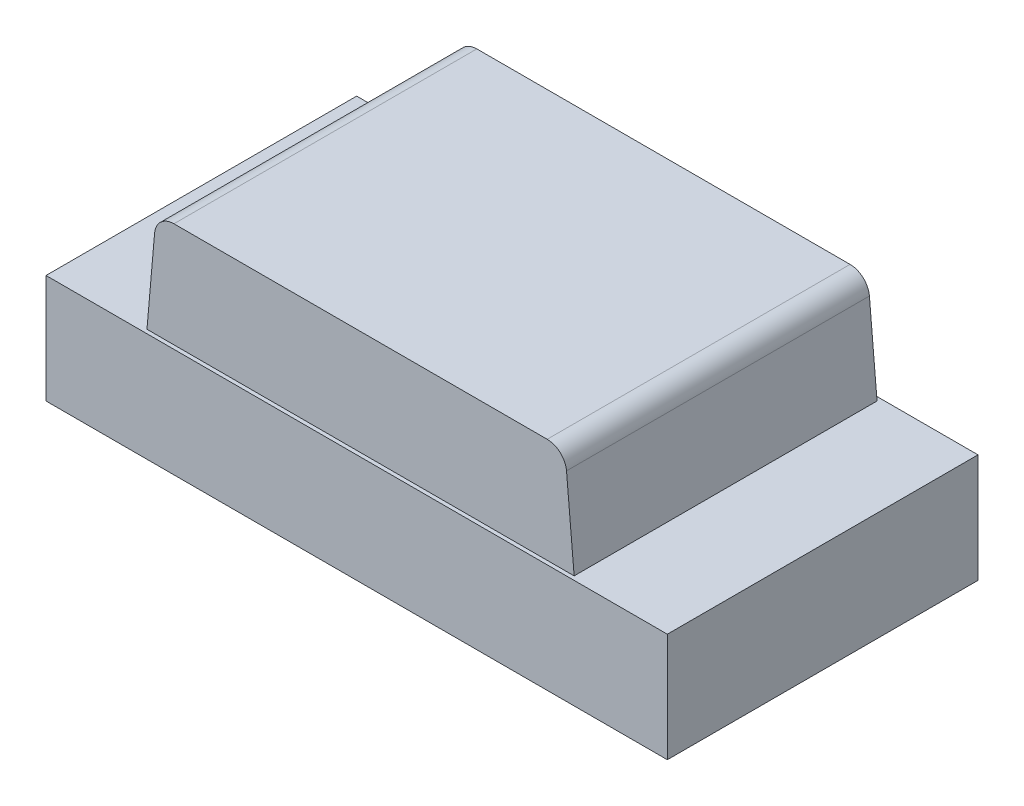
ISO-10303-21;
HEADER;
FILE_DESCRIPTION(('STEP AP214'),'2;1');
FILE_NAME('part.step','',(''),(''),'','','');
FILE_SCHEMA(('AUTOMOTIVE_DESIGN { 1 0 10303 214 1 1 1 1 }'));
ENDSEC;
DATA;
#1=APPLICATION_CONTEXT('core data for automotive mechanical design processes');
#2=APPLICATION_PROTOCOL_DEFINITION('international standard','automotive_design',2000,#1);
#3=PRODUCT_CONTEXT('',#1,'mechanical');
#4=PRODUCT('Part','Part','',(#3));
#5=PRODUCT_RELATED_PRODUCT_CATEGORY('part','',(#4));
#6=PRODUCT_DEFINITION_FORMATION('','',#4);
#7=PRODUCT_DEFINITION_CONTEXT('part definition',#1,'design');
#8=PRODUCT_DEFINITION('design','',#6,#7);
#9=PRODUCT_DEFINITION_SHAPE('','',#8);
#10=(LENGTH_UNIT() NAMED_UNIT(*) SI_UNIT(.MILLI.,.METRE.));
#11=(NAMED_UNIT(*) PLANE_ANGLE_UNIT() SI_UNIT($,.RADIAN.));
#12=(NAMED_UNIT(*) SI_UNIT($,.STERADIAN.) SOLID_ANGLE_UNIT());
#13=UNCERTAINTY_MEASURE_WITH_UNIT(LENGTH_MEASURE(1.E-05),#10,'distance_accuracy_value','');
#14=(GEOMETRIC_REPRESENTATION_CONTEXT(3) GLOBAL_UNCERTAINTY_ASSIGNED_CONTEXT((#13)) GLOBAL_UNIT_ASSIGNED_CONTEXT((#10,
#11,#12)) REPRESENTATION_CONTEXT('',''));
#15=CARTESIAN_POINT('',(0.,0.,0.));
#16=DIRECTION('',(0.,0.,1.));
#17=DIRECTION('',(1.,0.,0.));
#18=AXIS2_PLACEMENT_3D('',#15,#16,#17);
#19=CARTESIAN_POINT('',(0.,0.28,0.));
#20=DIRECTION('',(0.,1.,0.));
#21=DIRECTION('',(0.,0.,1.));
#22=AXIS2_PLACEMENT_3D('',#19,#20,#21);
#23=PLANE('',#22);
#24=DIRECTION('',(0.,0.,1.));
#25=VECTOR('',#24,1.);
#26=CARTESIAN_POINT('',(-0.8,0.28,0.4));
#27=LINE('',#26,#25);
#28=CARTESIAN_POINT('',(-0.8,0.28,-0.4));
#29=VERTEX_POINT('',#28);
#30=CARTESIAN_POINT('',(-0.8,0.28,0.4));
#31=VERTEX_POINT('',#30);
#32=EDGE_CURVE('E146',#29,#31,#27,.T.);
#33=ORIENTED_EDGE('',*,*,#32,.T.);
#34=DIRECTION('',(1.,0.,0.));
#35=VECTOR('',#34,1.);
#36=CARTESIAN_POINT('',(0.8,0.28,0.4));
#37=LINE('',#36,#35);
#38=CARTESIAN_POINT('',(0.8,0.28,0.4));
#39=VERTEX_POINT('',#38);
#40=EDGE_CURVE('E149',#31,#39,#37,.T.);
#41=ORIENTED_EDGE('',*,*,#40,.T.);
#42=DIRECTION('',(0.,0.,-1.));
#43=VECTOR('',#42,1.);
#44=CARTESIAN_POINT('',(0.8,0.28,0.4));
#45=LINE('',#44,#43);
#46=CARTESIAN_POINT('',(0.8,0.28,-0.4));
#47=VERTEX_POINT('',#46);
#48=EDGE_CURVE('E152',#39,#47,#45,.T.);
#49=ORIENTED_EDGE('',*,*,#48,.T.);
#50=DIRECTION('',(-1.,0.,0.));
#51=VECTOR('',#50,1.);
#52=CARTESIAN_POINT('',(0.8,0.28,-0.4));
#53=LINE('',#52,#51);
#54=EDGE_CURVE('E154',#47,#29,#53,.T.);
#55=ORIENTED_EDGE('',*,*,#54,.T.);
#56=EDGE_LOOP('',(#33,#41,#49,#55));
#57=FACE_BOUND('',#56,.T.);
#58=DIRECTION('',(0.,0.,-1.));
#59=VECTOR('',#58,1.);
#60=CARTESIAN_POINT('',(0.55,0.28,1.53265175583672));
#61=LINE('',#60,#59);
#62=CARTESIAN_POINT('',(0.55,0.28,0.39));
#63=VERTEX_POINT('',#62);
#64=CARTESIAN_POINT('',(0.55,0.28,-0.39));
#65=VERTEX_POINT('',#64);
#66=EDGE_CURVE('E136',#63,#65,#61,.T.);
#67=ORIENTED_EDGE('',*,*,#66,.F.);
#68=DIRECTION('',(-1.,0.,0.));
#69=VECTOR('',#68,1.);
#70=CARTESIAN_POINT('',(0.55,0.28,0.39));
#71=LINE('',#70,#69);
#72=CARTESIAN_POINT('',(-0.55,0.28,0.39));
#73=VERTEX_POINT('',#72);
#74=EDGE_CURVE('E135',#63,#73,#71,.T.);
#75=ORIENTED_EDGE('',*,*,#74,.T.);
#76=DIRECTION('',(0.,0.,-1.));
#77=VECTOR('',#76,1.);
#78=CARTESIAN_POINT('',(-0.55,0.28,1.53265175583672));
#79=LINE('',#78,#77);
#80=CARTESIAN_POINT('',(-0.55,0.28,-0.39));
#81=VERTEX_POINT('',#80);
#82=EDGE_CURVE('E129',#73,#81,#79,.T.);
#83=ORIENTED_EDGE('',*,*,#82,.T.);
#84=DIRECTION('',(-1.,0.,0.));
#85=VECTOR('',#84,1.);
#86=CARTESIAN_POINT('',(0.55,0.28,-0.39));
#87=LINE('',#86,#85);
#88=EDGE_CURVE('E115',#65,#81,#87,.T.);
#89=ORIENTED_EDGE('',*,*,#88,.F.);
#90=EDGE_LOOP('',(#67,#75,#83,#89));
#91=FACE_BOUND('',#90,.T.);
#92=ADVANCED_FACE('F36',(#57,#91),#23,.T.);
#93=CARTESIAN_POINT('',(-0.8,0.28,0.4));
#94=DIRECTION('',(1.,0.,0.));
#95=DIRECTION('',(0.,0.,-1.));
#96=AXIS2_PLACEMENT_3D('',#93,#94,#95);
#97=PLANE('',#96);
#98=DIRECTION('',(0.,0.,1.));
#99=VECTOR('',#98,1.);
#100=CARTESIAN_POINT('',(-0.8,0.,0.4));
#101=LINE('',#100,#99);
#102=CARTESIAN_POINT('',(-0.8,0.,-0.4));
#103=VERTEX_POINT('',#102);
#104=CARTESIAN_POINT('',(-0.8,0.,0.4));
#105=VERTEX_POINT('',#104);
#106=EDGE_CURVE('E157',#103,#105,#101,.T.);
#107=ORIENTED_EDGE('',*,*,#106,.T.);
#108=DIRECTION('',(0.,-1.,0.));
#109=VECTOR('',#108,1.);
#110=CARTESIAN_POINT('',(-0.8,0.28,0.4));
#111=LINE('',#110,#109);
#112=EDGE_CURVE('E173',#31,#105,#111,.T.);
#113=ORIENTED_EDGE('',*,*,#112,.F.);
#114=ORIENTED_EDGE('',*,*,#32,.F.);
#115=DIRECTION('',(0.,-1.,0.));
#116=VECTOR('',#115,1.);
#117=CARTESIAN_POINT('',(-0.8,0.28,-0.4));
#118=LINE('',#117,#116);
#119=EDGE_CURVE('E156',#29,#103,#118,.T.);
#120=ORIENTED_EDGE('',*,*,#119,.T.);
#121=EDGE_LOOP('',(#107,#113,#114,#120));
#122=FACE_BOUND('',#121,.T.);
#123=ADVANCED_FACE('F206',(#122),#97,.F.);
#124=CARTESIAN_POINT('',(0.8,0.28,0.4));
#125=DIRECTION('',(0.,0.,-1.));
#126=DIRECTION('',(-1.,0.,0.));
#127=AXIS2_PLACEMENT_3D('',#124,#125,#126);
#128=PLANE('',#127);
#129=DIRECTION('',(1.,0.,0.));
#130=VECTOR('',#129,1.);
#131=CARTESIAN_POINT('',(0.8,0.,0.4));
#132=LINE('',#131,#130);
#133=CARTESIAN_POINT('',(0.8,0.,0.4));
#134=VERTEX_POINT('',#133);
#135=EDGE_CURVE('E160',#105,#134,#132,.T.);
#136=ORIENTED_EDGE('',*,*,#135,.T.);
#137=DIRECTION('',(0.,-1.,0.));
#138=VECTOR('',#137,1.);
#139=CARTESIAN_POINT('',(0.8,0.28,0.4));
#140=LINE('',#139,#138);
#141=EDGE_CURVE('E170',#39,#134,#140,.T.);
#142=ORIENTED_EDGE('',*,*,#141,.F.);
#143=ORIENTED_EDGE('',*,*,#40,.F.);
#144=ORIENTED_EDGE('',*,*,#112,.T.);
#145=EDGE_LOOP('',(#136,#142,#143,#144));
#146=FACE_BOUND('',#145,.T.);
#147=ADVANCED_FACE('F212',(#146),#128,.F.);
#148=CARTESIAN_POINT('',(0.8,0.28,0.4));
#149=DIRECTION('',(-1.,0.,0.));
#150=DIRECTION('',(0.,0.,1.));
#151=AXIS2_PLACEMENT_3D('',#148,#149,#150);
#152=PLANE('',#151);
#153=DIRECTION('',(0.,0.,-1.));
#154=VECTOR('',#153,1.);
#155=CARTESIAN_POINT('',(0.8,0.,0.4));
#156=LINE('',#155,#154);
#157=CARTESIAN_POINT('',(0.8,0.,-0.4));
#158=VERTEX_POINT('',#157);
#159=EDGE_CURVE('E162',#134,#158,#156,.T.);
#160=ORIENTED_EDGE('',*,*,#159,.T.);
#161=DIRECTION('',(0.,-1.,0.));
#162=VECTOR('',#161,1.);
#163=CARTESIAN_POINT('',(0.8,0.28,-0.4));
#164=LINE('',#163,#162);
#165=EDGE_CURVE('E167',#47,#158,#164,.T.);
#166=ORIENTED_EDGE('',*,*,#165,.F.);
#167=ORIENTED_EDGE('',*,*,#48,.F.);
#168=ORIENTED_EDGE('',*,*,#141,.T.);
#169=EDGE_LOOP('',(#160,#166,#167,#168));
#170=FACE_BOUND('',#169,.T.);
#171=ADVANCED_FACE('F225',(#170),#152,.F.);
#172=CARTESIAN_POINT('',(0.8,0.28,-0.4));
#173=DIRECTION('',(0.,0.,1.));
#174=DIRECTION('',(1.,0.,0.));
#175=AXIS2_PLACEMENT_3D('',#172,#173,#174);
#176=PLANE('',#175);
#177=DIRECTION('',(-1.,0.,0.));
#178=VECTOR('',#177,1.);
#179=CARTESIAN_POINT('',(0.8,0.,-0.4));
#180=LINE('',#179,#178);
#181=EDGE_CURVE('E150',#158,#103,#180,.T.);
#182=ORIENTED_EDGE('',*,*,#181,.T.);
#183=ORIENTED_EDGE('',*,*,#119,.F.);
#184=ORIENTED_EDGE('',*,*,#54,.F.);
#185=ORIENTED_EDGE('',*,*,#165,.T.);
#186=EDGE_LOOP('',(#182,#183,#184,#185));
#187=FACE_BOUND('',#186,.T.);
#188=ADVANCED_FACE('F221',(#187),#176,.F.);
#189=CARTESIAN_POINT('',(0.,0.,0.));
#190=DIRECTION('',(0.,1.,0.));
#191=DIRECTION('',(0.,0.,1.));
#192=AXIS2_PLACEMENT_3D('',#189,#190,#191);
#193=PLANE('',#192);
#194=ORIENTED_EDGE('',*,*,#106,.F.);
#195=ORIENTED_EDGE('',*,*,#181,.F.);
#196=ORIENTED_EDGE('',*,*,#159,.F.);
#197=ORIENTED_EDGE('',*,*,#135,.F.);
#198=EDGE_LOOP('',(#194,#195,#196,#197));
#199=FACE_BOUND('',#198,.T.);
#200=ADVANCED_FACE('F218',(#199),#193,.F.);
#201=CARTESIAN_POINT('',(-0.55,0.28,1.53265175583672));
#202=DIRECTION('',(0.996194698091746,-0.0871557427476546,0.));
#203=DIRECTION('',(0.0871557427476546,0.996194698091746,0.));
#204=AXIS2_PLACEMENT_3D('',#201,#202,#203);
#205=PLANE('',#204);
#206=DIRECTION('',(0.0871557427476546,0.996194698091746,0.));
#207=VECTOR('',#206,1.);
#208=CARTESIAN_POINT('',(-0.55,0.28,0.39));
#209=LINE('',#208,#207);
#210=CARTESIAN_POINT('',(-0.530371237051718,0.504357787137383,0.39));
#211=VERTEX_POINT('',#210);
#212=EDGE_CURVE('E138',#73,#211,#209,.T.);
#213=ORIENTED_EDGE('',*,*,#212,.T.);
#214=DIRECTION('',(0.,0.,-1.));
#215=VECTOR('',#214,1.);
#216=CARTESIAN_POINT('',(-0.530371237051718,0.504357787137383,1.53265175583672));
#217=LINE('',#216,#215);
#218=CARTESIAN_POINT('',(-0.530371237051718,0.504357787137383,-0.39));
#219=VERTEX_POINT('',#218);
#220=EDGE_CURVE('E12',#211,#219,#217,.T.);
#221=ORIENTED_EDGE('',*,*,#220,.T.);
#222=DIRECTION('',(0.0871557427476546,0.996194698091746,0.));
#223=VECTOR('',#222,1.);
#224=CARTESIAN_POINT('',(-0.55,0.28,-0.39));
#225=LINE('',#224,#223);
#226=EDGE_CURVE('E119',#81,#219,#225,.T.);
#227=ORIENTED_EDGE('',*,*,#226,.F.);
#228=ORIENTED_EDGE('',*,*,#82,.F.);
#229=EDGE_LOOP('',(#213,#221,#227,#228));
#230=FACE_BOUND('',#229,.T.);
#231=ADVANCED_FACE('F128',(#230),#205,.F.);
#232=CARTESIAN_POINT('',(-0.526378060848002,0.55,1.53265175583672));
#233=DIRECTION('',(0.,-1.,0.));
#234=DIRECTION('',(0.,0.,-1.));
#235=AXIS2_PLACEMENT_3D('',#232,#233,#234);
#236=PLANE('',#235);
#237=DIRECTION('',(1.,0.,0.));
#238=VECTOR('',#237,1.);
#239=CARTESIAN_POINT('',(-0.526378060848002,0.55,0.39));
#240=LINE('',#239,#238);
#241=CARTESIAN_POINT('',(-0.48056150214713,0.55,0.39));
#242=VERTEX_POINT('',#241);
#243=CARTESIAN_POINT('',(0.48056150214713,0.55,0.39));
#244=VERTEX_POINT('',#243);
#245=EDGE_CURVE('E145',#242,#244,#240,.T.);
#246=ORIENTED_EDGE('',*,*,#245,.T.);
#247=DIRECTION('',(0.,0.,-1.));
#248=VECTOR('',#247,1.);
#249=CARTESIAN_POINT('',(0.48056150214713,0.55,1.53265175583672));
#250=LINE('',#249,#248);
#251=CARTESIAN_POINT('',(0.48056150214713,0.55,-0.39));
#252=VERTEX_POINT('',#251);
#253=EDGE_CURVE('E178',#244,#252,#250,.T.);
#254=ORIENTED_EDGE('',*,*,#253,.T.);
#255=DIRECTION('',(1.,0.,0.));
#256=VECTOR('',#255,1.);
#257=CARTESIAN_POINT('',(-0.526378060848001,0.55,-0.39));
#258=LINE('',#257,#256);
#259=CARTESIAN_POINT('',(-0.48056150214713,0.55,-0.39));
#260=VERTEX_POINT('',#259);
#261=EDGE_CURVE('E132',#260,#252,#258,.T.);
#262=ORIENTED_EDGE('',*,*,#261,.F.);
#263=DIRECTION('',(0.,0.,-1.));
#264=VECTOR('',#263,1.);
#265=CARTESIAN_POINT('',(-0.48056150214713,0.55,1.53265175583672));
#266=LINE('',#265,#264);
#267=EDGE_CURVE('E176',#260,#242,#266,.F.);
#268=ORIENTED_EDGE('',*,*,#267,.T.);
#269=EDGE_LOOP('',(#246,#254,#262,#268));
#270=FACE_BOUND('',#269,.T.);
#271=ADVANCED_FACE('F193',(#270),#236,.F.);
#272=CARTESIAN_POINT('',(0.526378060848002,0.55,1.53265175583672));
#273=DIRECTION('',(-0.996194698091746,-0.0871557427476546,0.));
#274=DIRECTION('',(0.0871557427476546,-0.996194698091746,0.));
#275=AXIS2_PLACEMENT_3D('',#272,#273,#274);
#276=PLANE('',#275);
#277=DIRECTION('',(0.0871557427476546,-0.996194698091746,0.));
#278=VECTOR('',#277,1.);
#279=CARTESIAN_POINT('',(0.526378060848002,0.55,-0.39));
#280=LINE('',#279,#278);
#281=CARTESIAN_POINT('',(0.530371237051718,0.504357787137383,-0.39));
#282=VERTEX_POINT('',#281);
#283=EDGE_CURVE('E120',#282,#65,#280,.T.);
#284=ORIENTED_EDGE('',*,*,#283,.F.);
#285=DIRECTION('',(0.,0.,-1.));
#286=VECTOR('',#285,1.);
#287=CARTESIAN_POINT('',(0.530371237051718,0.504357787137383,1.53265175583672));
#288=LINE('',#287,#286);
#289=CARTESIAN_POINT('',(0.530371237051718,0.504357787137383,0.39));
#290=VERTEX_POINT('',#289);
#291=EDGE_CURVE('E59',#282,#290,#288,.F.);
#292=ORIENTED_EDGE('',*,*,#291,.T.);
#293=DIRECTION('',(0.0871557427476546,-0.996194698091746,0.));
#294=VECTOR('',#293,1.);
#295=CARTESIAN_POINT('',(0.526378060848002,0.55,0.39));
#296=LINE('',#295,#294);
#297=EDGE_CURVE('E189',#290,#63,#296,.T.);
#298=ORIENTED_EDGE('',*,*,#297,.T.);
#299=ORIENTED_EDGE('',*,*,#66,.T.);
#300=EDGE_LOOP('',(#284,#292,#298,#299));
#301=FACE_BOUND('',#300,.T.);
#302=ADVANCED_FACE('F198',(#301),#276,.F.);
#303=CARTESIAN_POINT('',(0.8,0.28,0.39));
#304=DIRECTION('',(0.,0.,-1.));
#305=DIRECTION('',(-1.,0.,0.));
#306=AXIS2_PLACEMENT_3D('',#303,#304,#305);
#307=PLANE('',#306);
#308=ORIENTED_EDGE('',*,*,#297,.F.);
#309=CARTESIAN_POINT('',(0.48056150214713,0.5,0.39));
#310=DIRECTION('',(0.,0.,-1.));
#311=DIRECTION('',(-1.,0.,0.));
#312=AXIS2_PLACEMENT_3D('',#309,#310,#311);
#313=CIRCLE('',#312,0.05);
#314=EDGE_CURVE('E44',#290,#244,#313,.F.);
#315=ORIENTED_EDGE('',*,*,#314,.T.);
#316=ORIENTED_EDGE('',*,*,#245,.F.);
#317=CARTESIAN_POINT('',(-0.48056150214713,0.5,0.39));
#318=DIRECTION('',(0.,0.,-1.));
#319=DIRECTION('',(-1.,0.,0.));
#320=AXIS2_PLACEMENT_3D('',#317,#318,#319);
#321=CIRCLE('',#320,0.05);
#322=EDGE_CURVE('E51',#242,#211,#321,.F.);
#323=ORIENTED_EDGE('',*,*,#322,.T.);
#324=ORIENTED_EDGE('',*,*,#212,.F.);
#325=ORIENTED_EDGE('',*,*,#74,.F.);
#326=EDGE_LOOP('',(#308,#315,#316,#323,#324,#325));
#327=FACE_BOUND('',#326,.T.);
#328=ADVANCED_FACE('F188',(#327),#307,.F.);
#329=CARTESIAN_POINT('',(0.8,0.28,-0.39));
#330=DIRECTION('',(0.,0.,1.));
#331=DIRECTION('',(1.,0.,0.));
#332=AXIS2_PLACEMENT_3D('',#329,#330,#331);
#333=PLANE('',#332);
#334=ORIENTED_EDGE('',*,*,#261,.T.);
#335=CARTESIAN_POINT('',(0.48056150214713,0.5,-0.39));
#336=DIRECTION('',(0.,0.,1.));
#337=DIRECTION('',(1.,0.,0.));
#338=AXIS2_PLACEMENT_3D('',#335,#336,#337);
#339=CIRCLE('',#338,0.05);
#340=EDGE_CURVE('E183',#252,#282,#339,.F.);
#341=ORIENTED_EDGE('',*,*,#340,.T.);
#342=ORIENTED_EDGE('',*,*,#283,.T.);
#343=ORIENTED_EDGE('',*,*,#88,.T.);
#344=ORIENTED_EDGE('',*,*,#226,.T.);
#345=CARTESIAN_POINT('',(-0.48056150214713,0.5,-0.39));
#346=DIRECTION('',(0.,0.,1.));
#347=DIRECTION('',(1.,0.,0.));
#348=AXIS2_PLACEMENT_3D('',#345,#346,#347);
#349=CIRCLE('',#348,0.05);
#350=EDGE_CURVE('E181',#219,#260,#349,.F.);
#351=ORIENTED_EDGE('',*,*,#350,.T.);
#352=EDGE_LOOP('',(#334,#341,#342,#343,#344,#351));
#353=FACE_BOUND('',#352,.T.);
#354=ADVANCED_FACE('F118',(#353),#333,.F.);
#355=CARTESIAN_POINT('',(0.48056150214713,0.5,1.53265175583672));
#356=DIRECTION('',(0.,0.,-1.));
#357=DIRECTION('',(-1.,0.,0.));
#358=AXIS2_PLACEMENT_3D('',#355,#356,#357);
#359=CYLINDRICAL_SURFACE('',#358,0.05);
#360=ORIENTED_EDGE('',*,*,#314,.F.);
#361=ORIENTED_EDGE('',*,*,#291,.F.);
#362=ORIENTED_EDGE('',*,*,#340,.F.);
#363=ORIENTED_EDGE('',*,*,#253,.F.);
#364=EDGE_LOOP('',(#360,#361,#362,#363));
#365=FACE_BOUND('',#364,.T.);
#366=ADVANCED_FACE('F197',(#365),#359,.T.);
#367=CARTESIAN_POINT('',(-0.48056150214713,0.5,1.53265175583672));
#368=DIRECTION('',(0.,0.,-1.));
#369=DIRECTION('',(-1.,0.,0.));
#370=AXIS2_PLACEMENT_3D('',#367,#368,#369);
#371=CYLINDRICAL_SURFACE('',#370,0.05);
#372=ORIENTED_EDGE('',*,*,#322,.F.);
#373=ORIENTED_EDGE('',*,*,#267,.F.);
#374=ORIENTED_EDGE('',*,*,#350,.F.);
#375=ORIENTED_EDGE('',*,*,#220,.F.);
#376=EDGE_LOOP('',(#372,#373,#374,#375));
#377=FACE_BOUND('',#376,.T.);
#378=ADVANCED_FACE('F38',(#377),#371,.T.);
#379=CLOSED_SHELL('',(#92,#123,#147,#171,#188,#200,#231,#271,#302,#328,#354,#366,#378));
#380=MANIFOLD_SOLID_BREP('B2',#379);
#381=ADVANCED_BREP_SHAPE_REPRESENTATION('',(#18,#380),#14);
#382=SHAPE_DEFINITION_REPRESENTATION(#9,#381);
ENDSEC;
END-ISO-10303-21;
